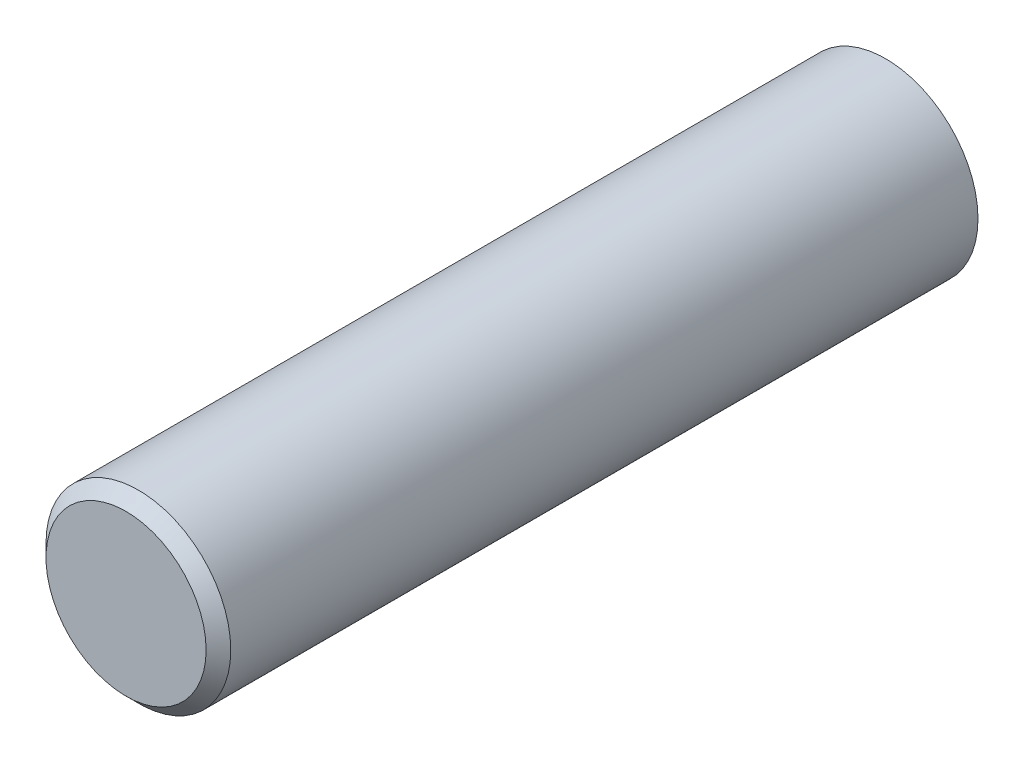
ISO-10303-21;
HEADER;
FILE_DESCRIPTION(('STEP AP214'),'2;1');
FILE_NAME('part.step','',(''),(''),'','','');
FILE_SCHEMA(('AUTOMOTIVE_DESIGN { 1 0 10303 214 1 1 1 1 }'));
ENDSEC;
DATA;
#1=APPLICATION_CONTEXT('core data for automotive mechanical design processes');
#2=APPLICATION_PROTOCOL_DEFINITION('international standard','automotive_design',2000,#1);
#3=PRODUCT_CONTEXT('',#1,'mechanical');
#4=PRODUCT('Part','Part','',(#3));
#5=PRODUCT_RELATED_PRODUCT_CATEGORY('part','',(#4));
#6=PRODUCT_DEFINITION_FORMATION('','',#4);
#7=PRODUCT_DEFINITION_CONTEXT('part definition',#1,'design');
#8=PRODUCT_DEFINITION('design','',#6,#7);
#9=PRODUCT_DEFINITION_SHAPE('','',#8);
#10=(LENGTH_UNIT() NAMED_UNIT(*) SI_UNIT(.MILLI.,.METRE.));
#11=(NAMED_UNIT(*) PLANE_ANGLE_UNIT() SI_UNIT($,.RADIAN.));
#12=(NAMED_UNIT(*) SI_UNIT($,.STERADIAN.) SOLID_ANGLE_UNIT());
#13=UNCERTAINTY_MEASURE_WITH_UNIT(LENGTH_MEASURE(1.E-05),#10,'distance_accuracy_value','');
#14=(GEOMETRIC_REPRESENTATION_CONTEXT(3) GLOBAL_UNCERTAINTY_ASSIGNED_CONTEXT((#13)) GLOBAL_UNIT_ASSIGNED_CONTEXT((#10,
#11,#12)) REPRESENTATION_CONTEXT('',''));
#15=CARTESIAN_POINT('',(0.,0.,0.));
#16=DIRECTION('',(0.,0.,1.));
#17=DIRECTION('',(1.,0.,0.));
#18=AXIS2_PLACEMENT_3D('',#15,#16,#17);
#19=CARTESIAN_POINT('',(55.1999999999998,8.09999999999994,-1.));
#20=DIRECTION('',(0.,0.,0.999999999999998));
#21=DIRECTION('',(1.,0.,0.));
#22=AXIS2_PLACEMENT_3D('',#19,#20,#21);
#23=PLANE('',#22);
#24=CARTESIAN_POINT('',(55.1999999999998,8.09999999999994,-1.));
#25=DIRECTION('',(0.,0.,0.999999999999998));
#26=DIRECTION('',(1.,0.,0.));
#27=AXIS2_PLACEMENT_3D('',#24,#25,#26);
#28=CIRCLE('',#27,1.95);
#29=CARTESIAN_POINT('',(57.1499999999999,8.09999999999994,-1.));
#30=VERTEX_POINT('',#29);
#31=EDGE_CURVE('E11',#30,#30,#28,.T.);
#32=ORIENTED_EDGE('',*,*,#31,.T.);
#33=EDGE_LOOP('',(#32));
#34=FACE_BOUND('',#33,.T.);
#35=ADVANCED_FACE('F17',(#34),#23,.T.);
#36=CARTESIAN_POINT('',(55.1999999999998,8.09999999999994,-19.5));
#37=DIRECTION('',(0.,0.,0.999999999999998));
#38=DIRECTION('',(1.,0.,0.));
#39=AXIS2_PLACEMENT_3D('',#36,#37,#38);
#40=PLANE('',#39);
#41=CARTESIAN_POINT('',(55.1999999999998,8.09999999999994,-19.5));
#42=DIRECTION('',(0.,0.,0.999999999999998));
#43=DIRECTION('',(1.,0.,0.));
#44=AXIS2_PLACEMENT_3D('',#41,#42,#43);
#45=CIRCLE('',#44,2.25);
#46=CARTESIAN_POINT('',(57.4499999999999,8.10000000000005,-19.5));
#47=VERTEX_POINT('',#46);
#48=EDGE_CURVE('E50',#47,#47,#45,.T.);
#49=ORIENTED_EDGE('',*,*,#48,.F.);
#50=EDGE_LOOP('',(#49));
#51=FACE_BOUND('',#50,.T.);
#52=ADVANCED_FACE('F64',(#51),#40,.F.);
#53=CARTESIAN_POINT('',(55.1999999999998,8.09999999999994,-1.30000000000002));
#54=DIRECTION('',(0.,0.,-0.999999999999998));
#55=DIRECTION('',(1.,0.,0.));
#56=AXIS2_PLACEMENT_3D('',#53,#54,#55);
#57=CONICAL_SURFACE('',#56,2.25,0.785398163397);
#58=DIRECTION('',(-0.707106781186548,0.,0.707106781186547));
#59=VECTOR('',#58,1.);
#60=CARTESIAN_POINT('',(57.4499999999999,8.10000000000005,-1.30000000000002));
#61=LINE('',#60,#59);
#62=CARTESIAN_POINT('',(57.4499999999999,8.10000000000005,-1.30000000000002));
#63=VERTEX_POINT('',#62);
#64=EDGE_CURVE('E27',#63,#30,#61,.T.);
#65=ORIENTED_EDGE('',*,*,#64,.F.);
#66=CARTESIAN_POINT('',(55.1999999999998,8.09999999999994,-1.30000000000002));
#67=DIRECTION('',(0.,0.,0.999999999999998));
#68=DIRECTION('',(1.,0.,0.));
#69=AXIS2_PLACEMENT_3D('',#66,#67,#68);
#70=CIRCLE('',#69,2.25);
#71=EDGE_CURVE('E47',#63,#63,#70,.T.);
#72=ORIENTED_EDGE('',*,*,#71,.T.);
#73=ORIENTED_EDGE('',*,*,#64,.T.);
#74=ORIENTED_EDGE('',*,*,#31,.F.);
#75=EDGE_LOOP('',(#65,#72,#73,#74));
#76=FACE_BOUND('',#75,.T.);
#77=ADVANCED_FACE('F61',(#76),#57,.T.);
#78=CARTESIAN_POINT('',(55.1999999999998,8.09999999999994,-19.5));
#79=DIRECTION('',(0.,0.,-0.999999999999998));
#80=DIRECTION('',(1.,0.,0.));
#81=AXIS2_PLACEMENT_3D('',#78,#79,#80);
#82=CYLINDRICAL_SURFACE('',#81,2.25);
#83=ORIENTED_EDGE('',*,*,#48,.T.);
#84=DIRECTION('',(0.,0.,0.999999999999998));
#85=VECTOR('',#84,1.);
#86=CARTESIAN_POINT('',(57.4499999999999,8.10000000000005,-19.5));
#87=LINE('',#86,#85);
#88=EDGE_CURVE('E42',#47,#63,#87,.T.);
#89=ORIENTED_EDGE('',*,*,#88,.T.);
#90=ORIENTED_EDGE('',*,*,#71,.F.);
#91=ORIENTED_EDGE('',*,*,#88,.F.);
#92=EDGE_LOOP('',(#83,#89,#90,#91));
#93=FACE_BOUND('',#92,.T.);
#94=ADVANCED_FACE('F44',(#93),#82,.T.);
#95=CLOSED_SHELL('',(#35,#52,#77,#94));
#96=MANIFOLD_SOLID_BREP('B1',#95);
#97=ADVANCED_BREP_SHAPE_REPRESENTATION('',(#18,#96),#14);
#98=SHAPE_DEFINITION_REPRESENTATION(#9,#97);
ENDSEC;
END-ISO-10303-21;
